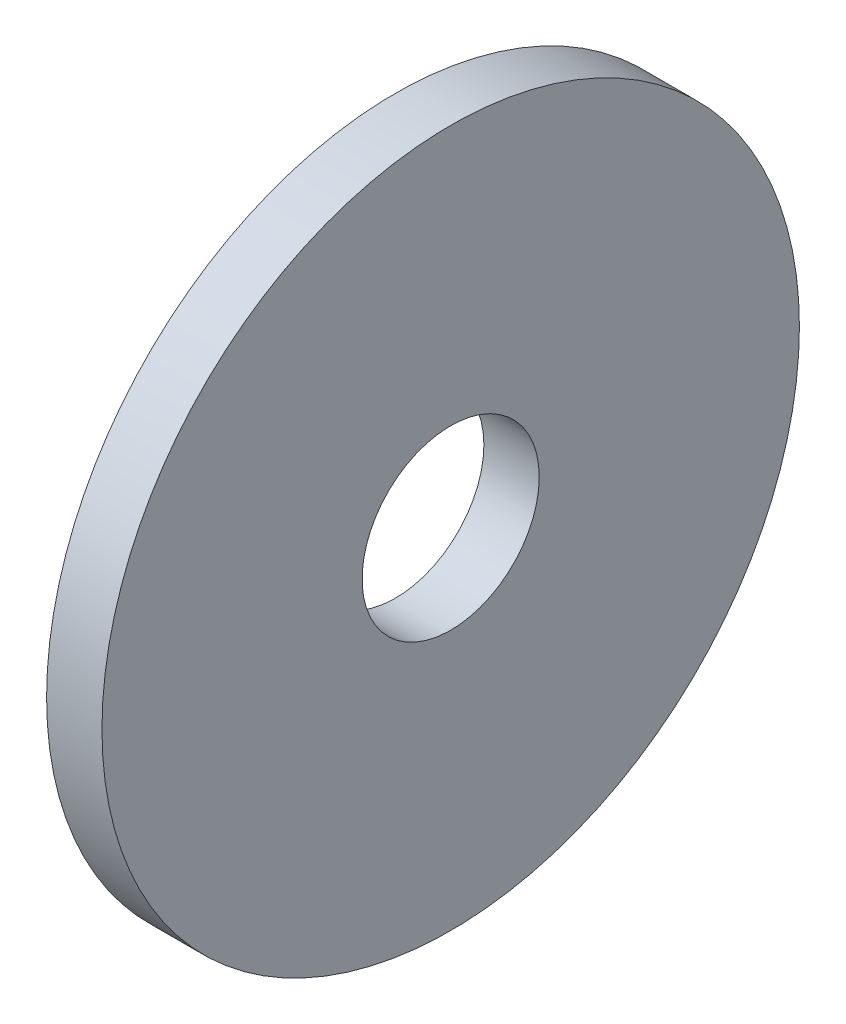
ISO-10303-21;
HEADER;
FILE_DESCRIPTION(('STEP AP214'),'2;1');
FILE_NAME('part.step','',(''),(''),'','','');
FILE_SCHEMA(('AUTOMOTIVE_DESIGN { 1 0 10303 214 1 1 1 1 }'));
ENDSEC;
DATA;
#1=APPLICATION_CONTEXT('core data for automotive mechanical design processes');
#2=APPLICATION_PROTOCOL_DEFINITION('international standard','automotive_design',2000,#1);
#3=PRODUCT_CONTEXT('',#1,'mechanical');
#4=PRODUCT('Part','Part','',(#3));
#5=PRODUCT_RELATED_PRODUCT_CATEGORY('part','',(#4));
#6=PRODUCT_DEFINITION_FORMATION('','',#4);
#7=PRODUCT_DEFINITION_CONTEXT('part definition',#1,'design');
#8=PRODUCT_DEFINITION('design','',#6,#7);
#9=PRODUCT_DEFINITION_SHAPE('','',#8);
#10=(LENGTH_UNIT() NAMED_UNIT(*) SI_UNIT(.MILLI.,.METRE.));
#11=(NAMED_UNIT(*) PLANE_ANGLE_UNIT() SI_UNIT($,.RADIAN.));
#12=(NAMED_UNIT(*) SI_UNIT($,.STERADIAN.) SOLID_ANGLE_UNIT());
#13=UNCERTAINTY_MEASURE_WITH_UNIT(LENGTH_MEASURE(1.E-05),#10,'distance_accuracy_value','');
#14=(GEOMETRIC_REPRESENTATION_CONTEXT(3) GLOBAL_UNCERTAINTY_ASSIGNED_CONTEXT((#13)) GLOBAL_UNIT_ASSIGNED_CONTEXT((#10,
#11,#12)) REPRESENTATION_CONTEXT('',''));
#15=CARTESIAN_POINT('',(0.,0.,0.));
#16=DIRECTION('',(0.,0.,1.));
#17=DIRECTION('',(1.,0.,0.));
#18=AXIS2_PLACEMENT_3D('',#15,#16,#17);
#19=CARTESIAN_POINT('',(2.5,0.,0.));
#20=DIRECTION('',(1.,0.,0.));
#21=DIRECTION('',(0.,0.,-1.));
#22=AXIS2_PLACEMENT_3D('',#19,#20,#21);
#23=PLANE('',#22);
#24=CARTESIAN_POINT('',(2.5,0.,0.));
#25=DIRECTION('',(1.,0.,0.));
#26=DIRECTION('',(0.,0.,-1.));
#27=AXIS2_PLACEMENT_3D('',#24,#25,#26);
#28=CIRCLE('',#27,15.75);
#29=CARTESIAN_POINT('',(2.5,0.,-15.75));
#30=VERTEX_POINT('',#29);
#31=EDGE_CURVE('E10',#30,#30,#28,.T.);
#32=ORIENTED_EDGE('',*,*,#31,.T.);
#33=EDGE_LOOP('',(#32));
#34=FACE_BOUND('',#33,.T.);
#35=CARTESIAN_POINT('',(2.5,0.,0.));
#36=DIRECTION('',(1.,0.,0.));
#37=DIRECTION('',(0.,0.,-1.));
#38=AXIS2_PLACEMENT_3D('',#35,#36,#37);
#39=CIRCLE('',#38,4.);
#40=CARTESIAN_POINT('',(2.5,0.,-4.));
#41=VERTEX_POINT('',#40);
#42=EDGE_CURVE('E50',#41,#41,#39,.T.);
#43=ORIENTED_EDGE('',*,*,#42,.F.);
#44=EDGE_LOOP('',(#43));
#45=FACE_BOUND('',#44,.T.);
#46=ADVANCED_FACE('F37',(#34,#45),#23,.T.);
#47=CARTESIAN_POINT('',(0.,0.,0.));
#48=DIRECTION('',(1.,0.,0.));
#49=DIRECTION('',(0.,0.,-1.));
#50=AXIS2_PLACEMENT_3D('',#47,#48,#49);
#51=PLANE('',#50);
#52=CARTESIAN_POINT('',(0.,0.,0.));
#53=DIRECTION('',(1.,0.,0.));
#54=DIRECTION('',(0.,0.,-1.));
#55=AXIS2_PLACEMENT_3D('',#52,#53,#54);
#56=CIRCLE('',#55,15.75);
#57=CARTESIAN_POINT('',(0.,0.,-15.75));
#58=VERTEX_POINT('',#57);
#59=EDGE_CURVE('E41',#58,#58,#56,.T.);
#60=ORIENTED_EDGE('',*,*,#59,.F.);
#61=EDGE_LOOP('',(#60));
#62=FACE_BOUND('',#61,.T.);
#63=CARTESIAN_POINT('',(0.,0.,0.));
#64=DIRECTION('',(1.,0.,0.));
#65=DIRECTION('',(0.,0.,-1.));
#66=AXIS2_PLACEMENT_3D('',#63,#64,#65);
#67=CIRCLE('',#66,4.);
#68=CARTESIAN_POINT('',(0.,0.,-4.));
#69=VERTEX_POINT('',#68);
#70=EDGE_CURVE('E52',#69,#69,#67,.T.);
#71=ORIENTED_EDGE('',*,*,#70,.T.);
#72=EDGE_LOOP('',(#71));
#73=FACE_BOUND('',#72,.T.);
#74=ADVANCED_FACE('F64',(#62,#73),#51,.F.);
#75=CARTESIAN_POINT('',(2.5,0.,0.));
#76=DIRECTION('',(-1.,0.,0.));
#77=DIRECTION('',(0.,0.,1.));
#78=AXIS2_PLACEMENT_3D('',#75,#76,#77);
#79=CYLINDRICAL_SURFACE('',#78,15.75);
#80=ORIENTED_EDGE('',*,*,#31,.F.);
#81=EDGE_LOOP('',(#80));
#82=FACE_BOUND('',#81,.T.);
#83=ORIENTED_EDGE('',*,*,#59,.T.);
#84=EDGE_LOOP('',(#83));
#85=FACE_BOUND('',#84,.T.);
#86=ADVANCED_FACE('F39',(#82,#85),#79,.T.);
#87=CARTESIAN_POINT('',(2.5,0.,0.));
#88=DIRECTION('',(-1.,0.,0.));
#89=DIRECTION('',(0.,0.,1.));
#90=AXIS2_PLACEMENT_3D('',#87,#88,#89);
#91=CYLINDRICAL_SURFACE('',#90,4.);
#92=ORIENTED_EDGE('',*,*,#42,.T.);
#93=EDGE_LOOP('',(#92));
#94=FACE_BOUND('',#93,.T.);
#95=ORIENTED_EDGE('',*,*,#70,.F.);
#96=EDGE_LOOP('',(#95));
#97=FACE_BOUND('',#96,.T.);
#98=ADVANCED_FACE('F60',(#94,#97),#91,.F.);
#99=CLOSED_SHELL('',(#46,#74,#86,#98));
#100=MANIFOLD_SOLID_BREP('B2',#99);
#101=ADVANCED_BREP_SHAPE_REPRESENTATION('',(#18,#100),#14);
#102=SHAPE_DEFINITION_REPRESENTATION(#9,#101);
ENDSEC;
END-ISO-10303-21;
